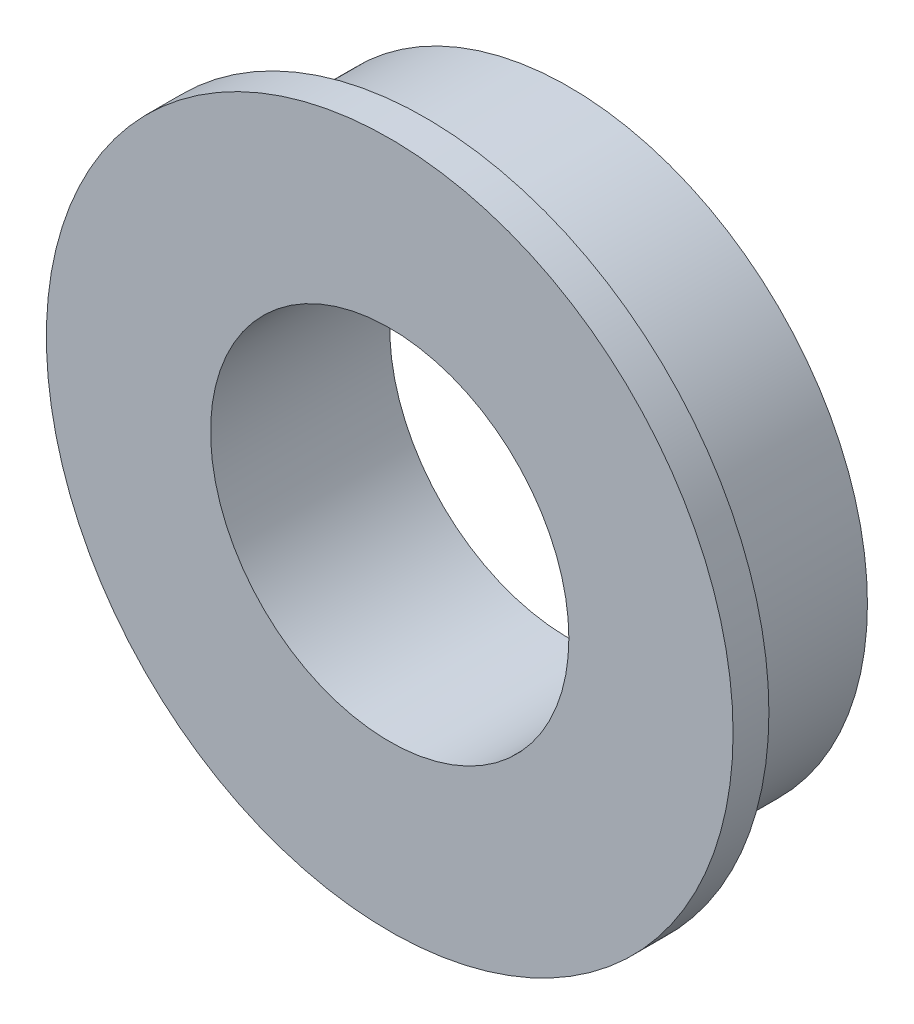
ISO-10303-21;
HEADER;
FILE_DESCRIPTION(('STEP AP214'),'2;1');
FILE_NAME('part.step','',(''),(''),'','','');
FILE_SCHEMA(('AUTOMOTIVE_DESIGN { 1 0 10303 214 1 1 1 1 }'));
ENDSEC;
DATA;
#1=APPLICATION_CONTEXT('core data for automotive mechanical design processes');
#2=APPLICATION_PROTOCOL_DEFINITION('international standard','automotive_design',2000,#1);
#3=PRODUCT_CONTEXT('',#1,'mechanical');
#4=PRODUCT('Part','Part','',(#3));
#5=PRODUCT_RELATED_PRODUCT_CATEGORY('part','',(#4));
#6=PRODUCT_DEFINITION_FORMATION('','',#4);
#7=PRODUCT_DEFINITION_CONTEXT('part definition',#1,'design');
#8=PRODUCT_DEFINITION('design','',#6,#7);
#9=PRODUCT_DEFINITION_SHAPE('','',#8);
#10=(LENGTH_UNIT() NAMED_UNIT(*) SI_UNIT(.MILLI.,.METRE.));
#11=(NAMED_UNIT(*) PLANE_ANGLE_UNIT() SI_UNIT($,.RADIAN.));
#12=(NAMED_UNIT(*) SI_UNIT($,.STERADIAN.) SOLID_ANGLE_UNIT());
#13=UNCERTAINTY_MEASURE_WITH_UNIT(LENGTH_MEASURE(1.E-05),#10,'distance_accuracy_value','');
#14=(GEOMETRIC_REPRESENTATION_CONTEXT(3) GLOBAL_UNCERTAINTY_ASSIGNED_CONTEXT((#13)) GLOBAL_UNIT_ASSIGNED_CONTEXT((#10,
#11,#12)) REPRESENTATION_CONTEXT('',''));
#15=CARTESIAN_POINT('',(0.,0.,0.));
#16=DIRECTION('',(0.,0.,1.));
#17=DIRECTION('',(1.,0.,0.));
#18=AXIS2_PLACEMENT_3D('',#15,#16,#17);
#19=CARTESIAN_POINT('',(0.,0.,0.));
#20=DIRECTION('',(0.,0.,1.));
#21=DIRECTION('',(1.,0.,0.));
#22=AXIS2_PLACEMENT_3D('',#19,#20,#21);
#23=CYLINDRICAL_SURFACE('',#22,5.75);
#24=CARTESIAN_POINT('',(0.,0.,0.6));
#25=DIRECTION('',(0.,0.,1.));
#26=DIRECTION('',(1.,0.,0.));
#27=AXIS2_PLACEMENT_3D('',#24,#25,#26);
#28=CIRCLE('',#27,5.75);
#29=CARTESIAN_POINT('',(5.75,0.,0.6));
#30=VERTEX_POINT('',#29);
#31=EDGE_CURVE('E10',#30,#30,#28,.T.);
#32=ORIENTED_EDGE('',*,*,#31,.F.);
#33=EDGE_LOOP('',(#32));
#34=FACE_BOUND('',#33,.T.);
#35=CARTESIAN_POINT('',(0.,0.,0.));
#36=DIRECTION('',(0.,0.,1.));
#37=DIRECTION('',(1.,0.,0.));
#38=AXIS2_PLACEMENT_3D('',#35,#36,#37);
#39=CIRCLE('',#38,5.75);
#40=CARTESIAN_POINT('',(5.75,0.,0.));
#41=VERTEX_POINT('',#40);
#42=EDGE_CURVE('E56',#41,#41,#39,.T.);
#43=ORIENTED_EDGE('',*,*,#42,.T.);
#44=EDGE_LOOP('',(#43));
#45=FACE_BOUND('',#44,.T.);
#46=ADVANCED_FACE('F34',(#34,#45),#23,.T.);
#47=CARTESIAN_POINT('',(0.,5.75,0.6));
#48=DIRECTION('',(0.,0.,-1.));
#49=DIRECTION('',(-1.,0.,0.));
#50=AXIS2_PLACEMENT_3D('',#47,#48,#49);
#51=PLANE('',#50);
#52=CARTESIAN_POINT('',(0.,0.,0.599999999999999));
#53=DIRECTION('',(0.,0.,1.));
#54=DIRECTION('',(1.,0.,0.));
#55=AXIS2_PLACEMENT_3D('',#52,#53,#54);
#56=CIRCLE('',#55,3.);
#57=CARTESIAN_POINT('',(3.,0.,0.599999999999999));
#58=VERTEX_POINT('',#57);
#59=EDGE_CURVE('E40',#58,#58,#56,.T.);
#60=ORIENTED_EDGE('',*,*,#59,.F.);
#61=EDGE_LOOP('',(#60));
#62=FACE_BOUND('',#61,.T.);
#63=ORIENTED_EDGE('',*,*,#31,.T.);
#64=EDGE_LOOP('',(#63));
#65=FACE_BOUND('',#64,.T.);
#66=ADVANCED_FACE('F81',(#62,#65),#51,.F.);
#67=CARTESIAN_POINT('',(0.,0.,0.));
#68=DIRECTION('',(0.,0.,1.));
#69=DIRECTION('',(1.,0.,0.));
#70=AXIS2_PLACEMENT_3D('',#67,#68,#69);
#71=CYLINDRICAL_SURFACE('',#70,3.);
#72=CARTESIAN_POINT('',(0.,0.,-2.4));
#73=DIRECTION('',(0.,0.,1.));
#74=DIRECTION('',(1.,0.,0.));
#75=AXIS2_PLACEMENT_3D('',#72,#73,#74);
#76=CIRCLE('',#75,3.);
#77=CARTESIAN_POINT('',(3.,0.,-2.4));
#78=VERTEX_POINT('',#77);
#79=EDGE_CURVE('E44',#78,#78,#76,.T.);
#80=ORIENTED_EDGE('',*,*,#79,.F.);
#81=EDGE_LOOP('',(#80));
#82=FACE_BOUND('',#81,.T.);
#83=ORIENTED_EDGE('',*,*,#59,.T.);
#84=EDGE_LOOP('',(#83));
#85=FACE_BOUND('',#84,.T.);
#86=ADVANCED_FACE('F76',(#82,#85),#71,.F.);
#87=CARTESIAN_POINT('',(0.,3.,-2.4));
#88=DIRECTION('',(0.,0.,1.));
#89=DIRECTION('',(1.,0.,0.));
#90=AXIS2_PLACEMENT_3D('',#87,#88,#89);
#91=PLANE('',#90);
#92=CARTESIAN_POINT('',(0.,0.,-2.4));
#93=DIRECTION('',(0.,0.,1.));
#94=DIRECTION('',(1.,0.,0.));
#95=AXIS2_PLACEMENT_3D('',#92,#93,#94);
#96=CIRCLE('',#95,5.);
#97=CARTESIAN_POINT('',(5.,0.,-2.4));
#98=VERTEX_POINT('',#97);
#99=EDGE_CURVE('E48',#98,#98,#96,.T.);
#100=ORIENTED_EDGE('',*,*,#99,.F.);
#101=EDGE_LOOP('',(#100));
#102=FACE_BOUND('',#101,.T.);
#103=ORIENTED_EDGE('',*,*,#79,.T.);
#104=EDGE_LOOP('',(#103));
#105=FACE_BOUND('',#104,.T.);
#106=ADVANCED_FACE('F70',(#102,#105),#91,.F.);
#107=CARTESIAN_POINT('',(0.,0.,0.));
#108=DIRECTION('',(0.,0.,1.));
#109=DIRECTION('',(1.,0.,0.));
#110=AXIS2_PLACEMENT_3D('',#107,#108,#109);
#111=CYLINDRICAL_SURFACE('',#110,5.);
#112=CARTESIAN_POINT('',(0.,0.,0.));
#113=DIRECTION('',(0.,0.,1.));
#114=DIRECTION('',(1.,0.,0.));
#115=AXIS2_PLACEMENT_3D('',#112,#113,#114);
#116=CIRCLE('',#115,5.);
#117=CARTESIAN_POINT('',(5.,0.,0.));
#118=VERTEX_POINT('',#117);
#119=EDGE_CURVE('E53',#118,#118,#116,.T.);
#120=ORIENTED_EDGE('',*,*,#119,.F.);
#121=EDGE_LOOP('',(#120));
#122=FACE_BOUND('',#121,.T.);
#123=ORIENTED_EDGE('',*,*,#99,.T.);
#124=EDGE_LOOP('',(#123));
#125=FACE_BOUND('',#124,.T.);
#126=ADVANCED_FACE('F64',(#122,#125),#111,.T.);
#127=CARTESIAN_POINT('',(0.,5.,0.));
#128=DIRECTION('',(0.,0.,1.));
#129=DIRECTION('',(1.,0.,0.));
#130=AXIS2_PLACEMENT_3D('',#127,#128,#129);
#131=PLANE('',#130);
#132=ORIENTED_EDGE('',*,*,#42,.F.);
#133=EDGE_LOOP('',(#132));
#134=FACE_BOUND('',#133,.T.);
#135=ORIENTED_EDGE('',*,*,#119,.T.);
#136=EDGE_LOOP('',(#135));
#137=FACE_BOUND('',#136,.T.);
#138=ADVANCED_FACE('F61',(#134,#137),#131,.F.);
#139=CLOSED_SHELL('',(#46,#66,#86,#106,#126,#138));
#140=MANIFOLD_SOLID_BREP('B2',#139);
#141=ADVANCED_BREP_SHAPE_REPRESENTATION('',(#18,#140),#14);
#142=SHAPE_DEFINITION_REPRESENTATION(#9,#141);
ENDSEC;
END-ISO-10303-21;
